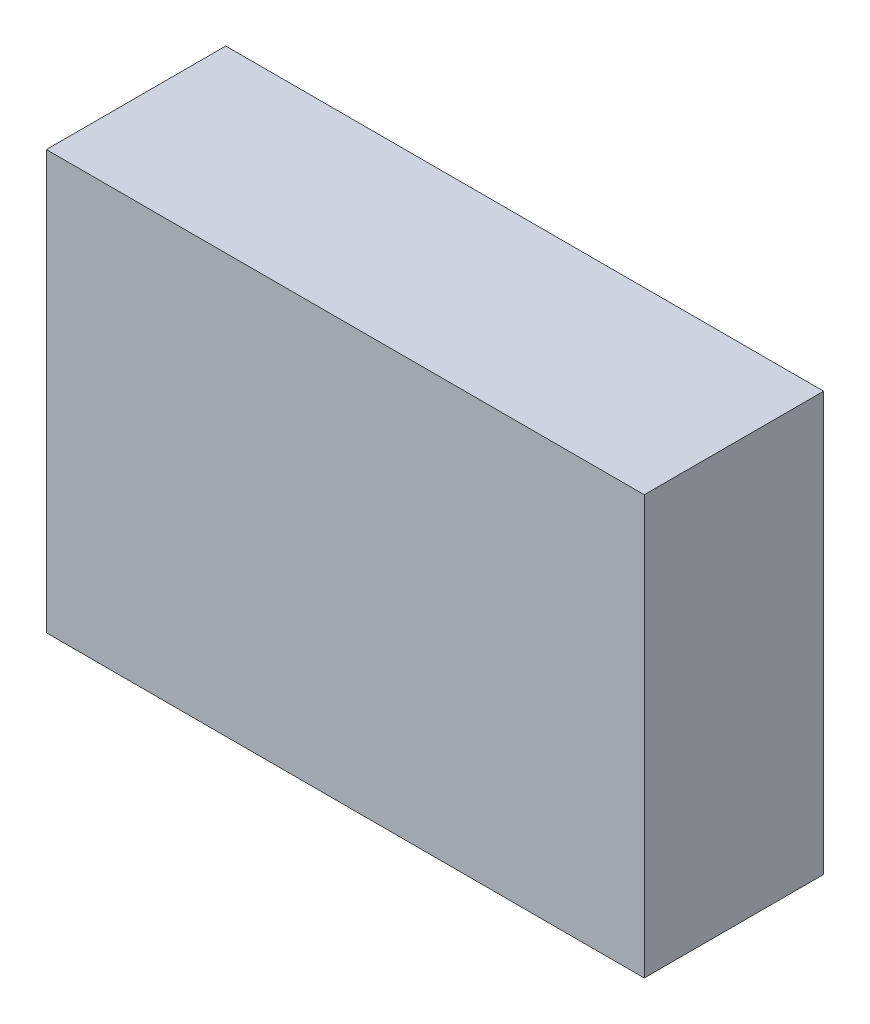
ISO-10303-21;
HEADER;
FILE_DESCRIPTION(('STEP AP214'),'2;1');
FILE_NAME('part.step','',(''),(''),'','','');
FILE_SCHEMA(('AUTOMOTIVE_DESIGN { 1 0 10303 214 1 1 1 1 }'));
ENDSEC;
DATA;
#1=APPLICATION_CONTEXT('core data for automotive mechanical design processes');
#2=APPLICATION_PROTOCOL_DEFINITION('international standard','automotive_design',2000,#1);
#3=PRODUCT_CONTEXT('',#1,'mechanical');
#4=PRODUCT('Part','Part','',(#3));
#5=PRODUCT_RELATED_PRODUCT_CATEGORY('part','',(#4));
#6=PRODUCT_DEFINITION_FORMATION('','',#4);
#7=PRODUCT_DEFINITION_CONTEXT('part definition',#1,'design');
#8=PRODUCT_DEFINITION('design','',#6,#7);
#9=PRODUCT_DEFINITION_SHAPE('','',#8);
#10=(LENGTH_UNIT() NAMED_UNIT(*) SI_UNIT(.MILLI.,.METRE.));
#11=(NAMED_UNIT(*) PLANE_ANGLE_UNIT() SI_UNIT($,.RADIAN.));
#12=(NAMED_UNIT(*) SI_UNIT($,.STERADIAN.) SOLID_ANGLE_UNIT());
#13=UNCERTAINTY_MEASURE_WITH_UNIT(LENGTH_MEASURE(1.E-05),#10,'distance_accuracy_value','');
#14=(GEOMETRIC_REPRESENTATION_CONTEXT(3) GLOBAL_UNCERTAINTY_ASSIGNED_CONTEXT((#13)) GLOBAL_UNIT_ASSIGNED_CONTEXT((#10,
#11,#12)) REPRESENTATION_CONTEXT('',''));
#15=CARTESIAN_POINT('',(0.,0.,0.));
#16=DIRECTION('',(0.,0.,1.));
#17=DIRECTION('',(1.,0.,0.));
#18=AXIS2_PLACEMENT_3D('',#15,#16,#17);
#19=CARTESIAN_POINT('',(-4.88609673905643,2.77707808564232,30.));
#20=DIRECTION('',(1.,0.,0.));
#21=DIRECTION('',(0.,1.,0.));
#22=AXIS2_PLACEMENT_3D('',#19,#20,#21);
#23=PLANE('',#22);
#24=DIRECTION('',(0.,-1.,0.));
#25=VECTOR('',#24,1.);
#26=CARTESIAN_POINT('',(-4.88609673905643,2.77707808564232,0.));
#27=LINE('',#26,#25);
#28=CARTESIAN_POINT('',(-4.88609673905643,2.77707808564232,0.));
#29=VERTEX_POINT('',#28);
#30=CARTESIAN_POINT('',(-4.88609673905643,-67.2229219143577,0.));
#31=VERTEX_POINT('',#30);
#32=EDGE_CURVE('E96',#29,#31,#27,.T.);
#33=ORIENTED_EDGE('',*,*,#32,.T.);
#34=DIRECTION('',(0.,0.,-1.));
#35=VECTOR('',#34,1.);
#36=CARTESIAN_POINT('',(-4.88609673905643,-67.2229219143577,30.));
#37=LINE('',#36,#35);
#38=CARTESIAN_POINT('',(-4.88609673905643,-67.2229219143577,30.));
#39=VERTEX_POINT('',#38);
#40=EDGE_CURVE('E11',#39,#31,#37,.T.);
#41=ORIENTED_EDGE('',*,*,#40,.F.);
#42=DIRECTION('',(0.,-1.,0.));
#43=VECTOR('',#42,1.);
#44=CARTESIAN_POINT('',(-4.88609673905643,2.77707808564232,30.));
#45=LINE('',#44,#43);
#46=CARTESIAN_POINT('',(-4.88609673905643,2.77707808564232,30.));
#47=VERTEX_POINT('',#46);
#48=EDGE_CURVE('E84',#47,#39,#45,.T.);
#49=ORIENTED_EDGE('',*,*,#48,.F.);
#50=DIRECTION('',(0.,0.,-1.));
#51=VECTOR('',#50,1.);
#52=CARTESIAN_POINT('',(-4.88609673905643,2.77707808564232,30.));
#53=LINE('',#52,#51);
#54=EDGE_CURVE('E92',#47,#29,#53,.T.);
#55=ORIENTED_EDGE('',*,*,#54,.T.);
#56=EDGE_LOOP('',(#33,#41,#49,#55));
#57=FACE_BOUND('',#56,.T.);
#58=ADVANCED_FACE('F33',(#57),#23,.F.);
#59=CARTESIAN_POINT('',(-4.88609673905643,-67.2229219143577,30.));
#60=DIRECTION('',(0.,1.,0.));
#61=DIRECTION('',(0.,0.,1.));
#62=AXIS2_PLACEMENT_3D('',#59,#60,#61);
#63=PLANE('',#62);
#64=DIRECTION('',(1.,0.,0.));
#65=VECTOR('',#64,1.);
#66=CARTESIAN_POINT('',(-4.88609673905643,-67.2229219143577,0.));
#67=LINE('',#66,#65);
#68=CARTESIAN_POINT('',(95.1139032609436,-67.2229219143577,0.));
#69=VERTEX_POINT('',#68);
#70=EDGE_CURVE('E88',#31,#69,#67,.T.);
#71=ORIENTED_EDGE('',*,*,#70,.T.);
#72=DIRECTION('',(0.,0.,-1.));
#73=VECTOR('',#72,1.);
#74=CARTESIAN_POINT('',(95.1139032609436,-67.2229219143577,30.));
#75=LINE('',#74,#73);
#76=CARTESIAN_POINT('',(95.1139032609436,-67.2229219143577,30.));
#77=VERTEX_POINT('',#76);
#78=EDGE_CURVE('E41',#77,#69,#75,.T.);
#79=ORIENTED_EDGE('',*,*,#78,.F.);
#80=DIRECTION('',(1.,0.,0.));
#81=VECTOR('',#80,1.);
#82=CARTESIAN_POINT('',(-4.88609673905643,-67.2229219143577,30.));
#83=LINE('',#82,#81);
#84=EDGE_CURVE('E79',#39,#77,#83,.T.);
#85=ORIENTED_EDGE('',*,*,#84,.F.);
#86=ORIENTED_EDGE('',*,*,#40,.T.);
#87=EDGE_LOOP('',(#71,#79,#85,#86));
#88=FACE_BOUND('',#87,.T.);
#89=ADVANCED_FACE('F87',(#88),#63,.F.);
#90=CARTESIAN_POINT('',(95.1139032609436,2.77707808564232,30.));
#91=DIRECTION('',(-1.,0.,0.));
#92=DIRECTION('',(0.,-1.,0.));
#93=AXIS2_PLACEMENT_3D('',#90,#91,#92);
#94=PLANE('',#93);
#95=DIRECTION('',(0.,1.,0.));
#96=VECTOR('',#95,1.);
#97=CARTESIAN_POINT('',(95.1139032609436,2.77707808564232,0.));
#98=LINE('',#97,#96);
#99=CARTESIAN_POINT('',(95.1139032609436,2.77707808564232,0.));
#100=VERTEX_POINT('',#99);
#101=EDGE_CURVE('E66',#69,#100,#98,.T.);
#102=ORIENTED_EDGE('',*,*,#101,.T.);
#103=DIRECTION('',(0.,0.,-1.));
#104=VECTOR('',#103,1.);
#105=CARTESIAN_POINT('',(95.1139032609436,2.77707808564232,30.));
#106=LINE('',#105,#104);
#107=CARTESIAN_POINT('',(95.1139032609436,2.77707808564232,30.));
#108=VERTEX_POINT('',#107);
#109=EDGE_CURVE('E89',#108,#100,#106,.T.);
#110=ORIENTED_EDGE('',*,*,#109,.F.);
#111=DIRECTION('',(0.,1.,0.));
#112=VECTOR('',#111,1.);
#113=CARTESIAN_POINT('',(95.1139032609436,2.77707808564232,30.));
#114=LINE('',#113,#112);
#115=EDGE_CURVE('E82',#77,#108,#114,.T.);
#116=ORIENTED_EDGE('',*,*,#115,.F.);
#117=ORIENTED_EDGE('',*,*,#78,.T.);
#118=EDGE_LOOP('',(#102,#110,#116,#117));
#119=FACE_BOUND('',#118,.T.);
#120=ADVANCED_FACE('F90',(#119),#94,.F.);
#121=CARTESIAN_POINT('',(-4.88609673905643,2.77707808564232,30.));
#122=DIRECTION('',(0.,-1.,0.));
#123=DIRECTION('',(0.,0.,-1.));
#124=AXIS2_PLACEMENT_3D('',#121,#122,#123);
#125=PLANE('',#124);
#126=DIRECTION('',(-1.,0.,0.));
#127=VECTOR('',#126,1.);
#128=CARTESIAN_POINT('',(-4.88609673905643,2.77707808564232,0.));
#129=LINE('',#128,#127);
#130=EDGE_CURVE('E72',#100,#29,#129,.T.);
#131=ORIENTED_EDGE('',*,*,#130,.T.);
#132=ORIENTED_EDGE('',*,*,#54,.F.);
#133=DIRECTION('',(-1.,0.,0.));
#134=VECTOR('',#133,1.);
#135=CARTESIAN_POINT('',(-4.88609673905643,2.77707808564232,30.));
#136=LINE('',#135,#134);
#137=EDGE_CURVE('E49',#108,#47,#136,.T.);
#138=ORIENTED_EDGE('',*,*,#137,.F.);
#139=ORIENTED_EDGE('',*,*,#109,.T.);
#140=EDGE_LOOP('',(#131,#132,#138,#139));
#141=FACE_BOUND('',#140,.T.);
#142=ADVANCED_FACE('F103',(#141),#125,.F.);
#143=CARTESIAN_POINT('',(0.,0.,30.));
#144=DIRECTION('',(0.,0.,1.));
#145=DIRECTION('',(1.,0.,0.));
#146=AXIS2_PLACEMENT_3D('',#143,#144,#145);
#147=PLANE('',#146);
#148=ORIENTED_EDGE('',*,*,#48,.T.);
#149=ORIENTED_EDGE('',*,*,#84,.T.);
#150=ORIENTED_EDGE('',*,*,#115,.T.);
#151=ORIENTED_EDGE('',*,*,#137,.T.);
#152=EDGE_LOOP('',(#148,#149,#150,#151));
#153=FACE_BOUND('',#152,.T.);
#154=ADVANCED_FACE('F80',(#153),#147,.T.);
#155=CARTESIAN_POINT('',(0.,0.,0.));
#156=DIRECTION('',(0.,0.,1.));
#157=DIRECTION('',(1.,0.,0.));
#158=AXIS2_PLACEMENT_3D('',#155,#156,#157);
#159=PLANE('',#158);
#160=ORIENTED_EDGE('',*,*,#32,.F.);
#161=ORIENTED_EDGE('',*,*,#130,.F.);
#162=ORIENTED_EDGE('',*,*,#101,.F.);
#163=ORIENTED_EDGE('',*,*,#70,.F.);
#164=EDGE_LOOP('',(#160,#161,#162,#163));
#165=FACE_BOUND('',#164,.T.);
#166=ADVANCED_FACE('F106',(#165),#159,.F.);
#167=CLOSED_SHELL('',(#58,#89,#120,#142,#154,#166));
#168=MANIFOLD_SOLID_BREP('B2',#167);
#169=ADVANCED_BREP_SHAPE_REPRESENTATION('',(#18,#168),#14);
#170=SHAPE_DEFINITION_REPRESENTATION(#9,#169);
ENDSEC;
END-ISO-10303-21;
